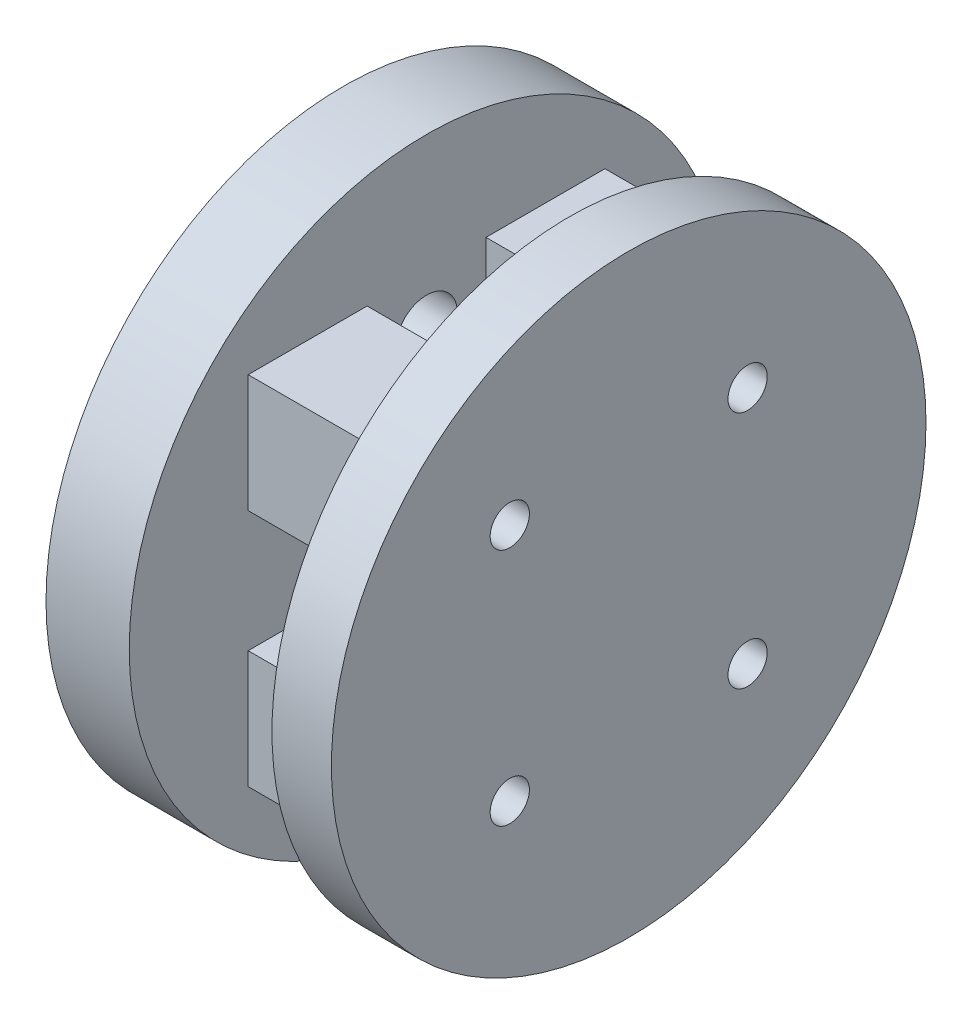
ISO-10303-21;
HEADER;
FILE_DESCRIPTION(('STEP AP214'),'2;1');
FILE_NAME('part.step','',(''),(''),'','','');
FILE_SCHEMA(('AUTOMOTIVE_DESIGN { 1 0 10303 214 1 1 1 1 }'));
ENDSEC;
DATA;
#1=APPLICATION_CONTEXT('core data for automotive mechanical design processes');
#2=APPLICATION_PROTOCOL_DEFINITION('international standard','automotive_design',2000,#1);
#3=PRODUCT_CONTEXT('',#1,'mechanical');
#4=PRODUCT('Part','Part','',(#3));
#5=PRODUCT_RELATED_PRODUCT_CATEGORY('part','',(#4));
#6=PRODUCT_DEFINITION_FORMATION('','',#4);
#7=PRODUCT_DEFINITION_CONTEXT('part definition',#1,'design');
#8=PRODUCT_DEFINITION('design','',#6,#7);
#9=PRODUCT_DEFINITION_SHAPE('','',#8);
#10=(LENGTH_UNIT() NAMED_UNIT(*) SI_UNIT(.MILLI.,.METRE.));
#11=(NAMED_UNIT(*) PLANE_ANGLE_UNIT() SI_UNIT($,.RADIAN.));
#12=(NAMED_UNIT(*) SI_UNIT($,.STERADIAN.) SOLID_ANGLE_UNIT());
#13=UNCERTAINTY_MEASURE_WITH_UNIT(LENGTH_MEASURE(1.E-05),#10,'distance_accuracy_value','');
#14=(GEOMETRIC_REPRESENTATION_CONTEXT(3) GLOBAL_UNCERTAINTY_ASSIGNED_CONTEXT((#13)) GLOBAL_UNIT_ASSIGNED_CONTEXT((#10,
#11,#12)) REPRESENTATION_CONTEXT('',''));
#15=CARTESIAN_POINT('',(0.,0.,0.));
#16=DIRECTION('',(0.,0.,1.));
#17=DIRECTION('',(1.,0.,0.));
#18=AXIS2_PLACEMENT_3D('',#15,#16,#17);
#19=CARTESIAN_POINT('',(24.,0.,0.));
#20=DIRECTION('',(-1.,0.,0.));
#21=DIRECTION('',(0.,0.,1.));
#22=AXIS2_PLACEMENT_3D('',#19,#20,#21);
#23=CYLINDRICAL_SURFACE('',#22,25.);
#24=CARTESIAN_POINT('',(24.,0.,0.));
#25=DIRECTION('',(1.,0.,0.));
#26=DIRECTION('',(0.,0.,-1.));
#27=AXIS2_PLACEMENT_3D('',#24,#25,#26);
#28=CIRCLE('',#27,25.);
#29=CARTESIAN_POINT('',(24.,0.,-25.));
#30=VERTEX_POINT('',#29);
#31=EDGE_CURVE('E11',#30,#30,#28,.T.);
#32=ORIENTED_EDGE('',*,*,#31,.F.);
#33=EDGE_LOOP('',(#32));
#34=FACE_BOUND('',#33,.T.);
#35=CARTESIAN_POINT('',(19.,0.,0.));
#36=DIRECTION('',(1.,0.,0.));
#37=DIRECTION('',(0.,0.,-1.));
#38=AXIS2_PLACEMENT_3D('',#35,#36,#37);
#39=CIRCLE('',#38,25.);
#40=CARTESIAN_POINT('',(19.,0.,-25.));
#41=VERTEX_POINT('',#40);
#42=EDGE_CURVE('E54',#41,#41,#39,.T.);
#43=ORIENTED_EDGE('',*,*,#42,.T.);
#44=EDGE_LOOP('',(#43));
#45=FACE_BOUND('',#44,.T.);
#46=ADVANCED_FACE('F47',(#34,#45),#23,.T.);
#47=CARTESIAN_POINT('',(24.,0.,0.));
#48=DIRECTION('',(1.,0.,0.));
#49=DIRECTION('',(0.,0.,-1.));
#50=AXIS2_PLACEMENT_3D('',#47,#48,#49);
#51=PLANE('',#50);
#52=CARTESIAN_POINT('',(24.,10.05,-10.));
#53=DIRECTION('',(1.,0.,0.));
#54=DIRECTION('',(0.,0.,-1.));
#55=AXIS2_PLACEMENT_3D('',#52,#53,#54);
#56=CIRCLE('',#55,1.65);
#57=CARTESIAN_POINT('',(24.,10.05,-11.65));
#58=VERTEX_POINT('',#57);
#59=EDGE_CURVE('E125',#58,#58,#56,.T.);
#60=ORIENTED_EDGE('',*,*,#59,.F.);
#61=EDGE_LOOP('',(#60));
#62=FACE_BOUND('',#61,.T.);
#63=CARTESIAN_POINT('',(24.,-10.05,-10.));
#64=DIRECTION('',(1.,0.,0.));
#65=DIRECTION('',(0.,0.,-1.));
#66=AXIS2_PLACEMENT_3D('',#63,#64,#65);
#67=CIRCLE('',#66,1.65);
#68=CARTESIAN_POINT('',(24.,-10.05,-11.65));
#69=VERTEX_POINT('',#68);
#70=EDGE_CURVE('E121',#69,#69,#67,.T.);
#71=ORIENTED_EDGE('',*,*,#70,.F.);
#72=EDGE_LOOP('',(#71));
#73=FACE_BOUND('',#72,.T.);
#74=CARTESIAN_POINT('',(24.,-10.05,10.));
#75=DIRECTION('',(1.,0.,0.));
#76=DIRECTION('',(0.,0.,-1.));
#77=AXIS2_PLACEMENT_3D('',#74,#75,#76);
#78=CIRCLE('',#77,1.65);
#79=CARTESIAN_POINT('',(24.,-10.05,8.35));
#80=VERTEX_POINT('',#79);
#81=EDGE_CURVE('E119',#80,#80,#78,.T.);
#82=ORIENTED_EDGE('',*,*,#81,.F.);
#83=EDGE_LOOP('',(#82));
#84=FACE_BOUND('',#83,.T.);
#85=CARTESIAN_POINT('',(24.,10.05,10.));
#86=DIRECTION('',(1.,0.,0.));
#87=DIRECTION('',(0.,0.,-1.));
#88=AXIS2_PLACEMENT_3D('',#85,#86,#87);
#89=CIRCLE('',#88,1.65);
#90=CARTESIAN_POINT('',(24.,10.05,8.35));
#91=VERTEX_POINT('',#90);
#92=EDGE_CURVE('E61',#91,#91,#89,.T.);
#93=ORIENTED_EDGE('',*,*,#92,.F.);
#94=EDGE_LOOP('',(#93));
#95=FACE_BOUND('',#94,.T.);
#96=ORIENTED_EDGE('',*,*,#31,.T.);
#97=EDGE_LOOP('',(#96));
#98=FACE_BOUND('',#97,.T.);
#99=ADVANCED_FACE('F92',(#62,#73,#84,#95,#98),#51,.T.);
#100=CARTESIAN_POINT('',(19.,0.,0.));
#101=DIRECTION('',(1.,0.,0.));
#102=DIRECTION('',(0.,0.,-1.));
#103=AXIS2_PLACEMENT_3D('',#100,#101,#102);
#104=PLANE('',#103);
#105=CARTESIAN_POINT('',(19.,10.05,-10.));
#106=DIRECTION('',(1.,0.,0.));
#107=DIRECTION('',(0.,0.,-1.));
#108=AXIS2_PLACEMENT_3D('',#105,#106,#107);
#109=CIRCLE('',#108,1.65);
#110=CARTESIAN_POINT('',(19.,10.05,-11.65));
#111=VERTEX_POINT('',#110);
#112=EDGE_CURVE('E50',#111,#111,#109,.T.);
#113=ORIENTED_EDGE('',*,*,#112,.T.);
#114=EDGE_LOOP('',(#113));
#115=FACE_BOUND('',#114,.T.);
#116=CARTESIAN_POINT('',(19.,-10.05,-10.));
#117=DIRECTION('',(1.,0.,0.));
#118=DIRECTION('',(0.,0.,-1.));
#119=AXIS2_PLACEMENT_3D('',#116,#117,#118);
#120=CIRCLE('',#119,1.65);
#121=CARTESIAN_POINT('',(19.,-10.05,-11.65));
#122=VERTEX_POINT('',#121);
#123=EDGE_CURVE('E69',#122,#122,#120,.T.);
#124=ORIENTED_EDGE('',*,*,#123,.T.);
#125=EDGE_LOOP('',(#124));
#126=FACE_BOUND('',#125,.T.);
#127=CARTESIAN_POINT('',(19.,-10.05,10.));
#128=DIRECTION('',(1.,0.,0.));
#129=DIRECTION('',(0.,0.,-1.));
#130=AXIS2_PLACEMENT_3D('',#127,#128,#129);
#131=CIRCLE('',#130,1.65);
#132=CARTESIAN_POINT('',(19.,-10.05,8.35));
#133=VERTEX_POINT('',#132);
#134=EDGE_CURVE('E67',#133,#133,#131,.T.);
#135=ORIENTED_EDGE('',*,*,#134,.T.);
#136=EDGE_LOOP('',(#135));
#137=FACE_BOUND('',#136,.T.);
#138=CARTESIAN_POINT('',(19.,10.05,10.));
#139=DIRECTION('',(1.,0.,0.));
#140=DIRECTION('',(0.,0.,-1.));
#141=AXIS2_PLACEMENT_3D('',#138,#139,#140);
#142=CIRCLE('',#141,1.65);
#143=CARTESIAN_POINT('',(19.,10.05,8.35));
#144=VERTEX_POINT('',#143);
#145=EDGE_CURVE('E64',#144,#144,#142,.T.);
#146=ORIENTED_EDGE('',*,*,#145,.T.);
#147=EDGE_LOOP('',(#146));
#148=FACE_BOUND('',#147,.T.);
#149=ORIENTED_EDGE('',*,*,#42,.F.);
#150=EDGE_LOOP('',(#149));
#151=FACE_BOUND('',#150,.T.);
#152=ADVANCED_FACE('F76',(#115,#126,#137,#148,#151),#104,.F.);
#153=CARTESIAN_POINT('',(0.,10.05,10.));
#154=DIRECTION('',(1.,0.,0.));
#155=DIRECTION('',(0.,0.,-1.));
#156=AXIS2_PLACEMENT_3D('',#153,#154,#155);
#157=CYLINDRICAL_SURFACE('',#156,1.65);
#158=ORIENTED_EDGE('',*,*,#92,.T.);
#159=EDGE_LOOP('',(#158));
#160=FACE_BOUND('',#159,.T.);
#161=ORIENTED_EDGE('',*,*,#145,.F.);
#162=EDGE_LOOP('',(#161));
#163=FACE_BOUND('',#162,.T.);
#164=ADVANCED_FACE('F103',(#160,#163),#157,.F.);
#165=CARTESIAN_POINT('',(0.,-10.05,10.));
#166=DIRECTION('',(1.,0.,0.));
#167=DIRECTION('',(0.,0.,-1.));
#168=AXIS2_PLACEMENT_3D('',#165,#166,#167);
#169=CYLINDRICAL_SURFACE('',#168,1.65);
#170=ORIENTED_EDGE('',*,*,#81,.T.);
#171=EDGE_LOOP('',(#170));
#172=FACE_BOUND('',#171,.T.);
#173=ORIENTED_EDGE('',*,*,#134,.F.);
#174=EDGE_LOOP('',(#173));
#175=FACE_BOUND('',#174,.T.);
#176=ADVANCED_FACE('F86',(#172,#175),#169,.F.);
#177=CARTESIAN_POINT('',(0.,-10.05,-10.));
#178=DIRECTION('',(1.,0.,0.));
#179=DIRECTION('',(0.,0.,-1.));
#180=AXIS2_PLACEMENT_3D('',#177,#178,#179);
#181=CYLINDRICAL_SURFACE('',#180,1.65);
#182=ORIENTED_EDGE('',*,*,#70,.T.);
#183=EDGE_LOOP('',(#182));
#184=FACE_BOUND('',#183,.T.);
#185=ORIENTED_EDGE('',*,*,#123,.F.);
#186=EDGE_LOOP('',(#185));
#187=FACE_BOUND('',#186,.T.);
#188=ADVANCED_FACE('F80',(#184,#187),#181,.F.);
#189=CARTESIAN_POINT('',(0.,10.05,-10.));
#190=DIRECTION('',(1.,0.,0.));
#191=DIRECTION('',(0.,0.,-1.));
#192=AXIS2_PLACEMENT_3D('',#189,#190,#191);
#193=CYLINDRICAL_SURFACE('',#192,1.65);
#194=ORIENTED_EDGE('',*,*,#59,.T.);
#195=EDGE_LOOP('',(#194));
#196=FACE_BOUND('',#195,.T.);
#197=ORIENTED_EDGE('',*,*,#112,.F.);
#198=EDGE_LOOP('',(#197));
#199=FACE_BOUND('',#198,.T.);
#200=ADVANCED_FACE('F78',(#196,#199),#193,.F.);
#201=CLOSED_SHELL('',(#46,#99,#152,#164,#176,#188,#200));
#202=MANIFOLD_SOLID_BREP('B2',#201);
#203=CARTESIAN_POINT('',(7.,15.,-15.));
#204=DIRECTION('',(0.,0.,1.));
#205=DIRECTION('',(0.,-1.,0.));
#206=AXIS2_PLACEMENT_3D('',#203,#204,#205);
#207=PLANE('',#206);
#208=DIRECTION('',(-1.,0.,0.));
#209=VECTOR('',#208,1.);
#210=CARTESIAN_POINT('',(7.,-15.,-15.));
#211=LINE('',#210,#209);
#212=CARTESIAN_POINT('',(19.,-15.,-15.));
#213=VERTEX_POINT('',#212);
#214=CARTESIAN_POINT('',(7.00000000000003,-15.,-15.));
#215=VERTEX_POINT('',#214);
#216=EDGE_CURVE('E287',#213,#215,#211,.T.);
#217=ORIENTED_EDGE('',*,*,#216,.T.);
#218=DIRECTION('',(0.,-1.,0.));
#219=VECTOR('',#218,1.);
#220=CARTESIAN_POINT('',(7.00000000000001,-15.,-15.));
#221=LINE('',#220,#219);
#222=CARTESIAN_POINT('',(7.00000000000001,-5.1,-15.));
#223=VERTEX_POINT('',#222);
#224=EDGE_CURVE('E337',#223,#215,#221,.T.);
#225=ORIENTED_EDGE('',*,*,#224,.F.);
#226=DIRECTION('',(-1.,0.,0.));
#227=VECTOR('',#226,1.);
#228=CARTESIAN_POINT('',(19.,-5.1,-15.));
#229=LINE('',#228,#227);
#230=CARTESIAN_POINT('',(19.,-5.1,-15.));
#231=VERTEX_POINT('',#230);
#232=EDGE_CURVE('E384',#231,#223,#229,.T.);
#233=ORIENTED_EDGE('',*,*,#232,.F.);
#234=DIRECTION('',(0.,1.,0.));
#235=VECTOR('',#234,1.);
#236=CARTESIAN_POINT('',(19.,-15.,-15.));
#237=LINE('',#236,#235);
#238=EDGE_CURVE('E403',#213,#231,#237,.T.);
#239=ORIENTED_EDGE('',*,*,#238,.F.);
#240=EDGE_LOOP('',(#217,#225,#233,#239));
#241=FACE_BOUND('',#240,.T.);
#242=ADVANCED_FACE('F172',(#241),#207,.F.);
#243=CARTESIAN_POINT('',(7.,15.,15.));
#244=DIRECTION('',(0.,-1.,0.));
#245=DIRECTION('',(0.,0.,-1.));
#246=AXIS2_PLACEMENT_3D('',#243,#244,#245);
#247=PLANE('',#246);
#248=DIRECTION('',(-1.,0.,0.));
#249=VECTOR('',#248,1.);
#250=CARTESIAN_POINT('',(7.,15.,-15.));
#251=LINE('',#250,#249);
#252=CARTESIAN_POINT('',(19.,15.,-15.));
#253=VERTEX_POINT('',#252);
#254=CARTESIAN_POINT('',(7.00000000000003,15.,-15.));
#255=VERTEX_POINT('',#254);
#256=EDGE_CURVE('E45',#253,#255,#251,.T.);
#257=ORIENTED_EDGE('',*,*,#256,.T.);
#258=DIRECTION('',(0.,0.,-1.));
#259=VECTOR('',#258,1.);
#260=CARTESIAN_POINT('',(7.00000000000001,15.,-15.));
#261=LINE('',#260,#259);
#262=CARTESIAN_POINT('',(7.00000000000001,15.,-5.));
#263=VERTEX_POINT('',#262);
#264=EDGE_CURVE('E330',#263,#255,#261,.T.);
#265=ORIENTED_EDGE('',*,*,#264,.F.);
#266=DIRECTION('',(-1.,0.,0.));
#267=VECTOR('',#266,1.);
#268=CARTESIAN_POINT('',(19.,15.,-5.));
#269=LINE('',#268,#267);
#270=CARTESIAN_POINT('',(19.,15.,-5.));
#271=VERTEX_POINT('',#270);
#272=EDGE_CURVE('E363',#271,#263,#269,.T.);
#273=ORIENTED_EDGE('',*,*,#272,.F.);
#274=DIRECTION('',(0.,0.,1.));
#275=VECTOR('',#274,1.);
#276=CARTESIAN_POINT('',(19.,15.,-15.));
#277=LINE('',#276,#275);
#278=EDGE_CURVE('E380',#253,#271,#277,.T.);
#279=ORIENTED_EDGE('',*,*,#278,.F.);
#280=EDGE_LOOP('',(#257,#265,#273,#279));
#281=FACE_BOUND('',#280,.T.);
#282=ADVANCED_FACE('F497',(#281),#247,.F.);
#283=CARTESIAN_POINT('',(7.,15.,15.));
#284=DIRECTION('',(0.,0.,-1.));
#285=DIRECTION('',(0.,1.,0.));
#286=AXIS2_PLACEMENT_3D('',#283,#284,#285);
#287=PLANE('',#286);
#288=DIRECTION('',(-1.,0.,0.));
#289=VECTOR('',#288,1.);
#290=CARTESIAN_POINT('',(7.,15.,15.));
#291=LINE('',#290,#289);
#292=CARTESIAN_POINT('',(19.,15.,15.));
#293=VERTEX_POINT('',#292);
#294=CARTESIAN_POINT('',(7.00000000000003,15.,15.));
#295=VERTEX_POINT('',#294);
#296=EDGE_CURVE('E181',#293,#295,#291,.T.);
#297=ORIENTED_EDGE('',*,*,#296,.T.);
#298=DIRECTION('',(0.,1.,0.));
#299=VECTOR('',#298,1.);
#300=CARTESIAN_POINT('',(7.00000000000001,15.,15.));
#301=LINE('',#300,#299);
#302=CARTESIAN_POINT('',(7.00000000000001,5.1,15.));
#303=VERTEX_POINT('',#302);
#304=EDGE_CURVE('E285',#303,#295,#301,.T.);
#305=ORIENTED_EDGE('',*,*,#304,.F.);
#306=DIRECTION('',(-1.,0.,0.));
#307=VECTOR('',#306,1.);
#308=CARTESIAN_POINT('',(19.,5.1,15.));
#309=LINE('',#308,#307);
#310=CARTESIAN_POINT('',(19.,5.1,15.));
#311=VERTEX_POINT('',#310);
#312=EDGE_CURVE('E282',#311,#303,#309,.T.);
#313=ORIENTED_EDGE('',*,*,#312,.F.);
#314=DIRECTION('',(0.,-1.,0.));
#315=VECTOR('',#314,1.);
#316=CARTESIAN_POINT('',(19.,15.,15.));
#317=LINE('',#316,#315);
#318=EDGE_CURVE('E269',#293,#311,#317,.T.);
#319=ORIENTED_EDGE('',*,*,#318,.F.);
#320=EDGE_LOOP('',(#297,#305,#313,#319));
#321=FACE_BOUND('',#320,.T.);
#322=ADVANCED_FACE('F283',(#321),#287,.F.);
#323=CARTESIAN_POINT('',(7.,-15.,15.));
#324=DIRECTION('',(0.,1.,0.));
#325=DIRECTION('',(0.,0.,1.));
#326=AXIS2_PLACEMENT_3D('',#323,#324,#325);
#327=PLANE('',#326);
#328=DIRECTION('',(-1.,0.,0.));
#329=VECTOR('',#328,1.);
#330=CARTESIAN_POINT('',(7.,-15.,15.));
#331=LINE('',#330,#329);
#332=CARTESIAN_POINT('',(19.,-15.,15.));
#333=VERTEX_POINT('',#332);
#334=CARTESIAN_POINT('',(7.00000000000001,-15.,15.));
#335=VERTEX_POINT('',#334);
#336=EDGE_CURVE('E306',#333,#335,#331,.T.);
#337=ORIENTED_EDGE('',*,*,#336,.T.);
#338=DIRECTION('',(0.,0.,1.));
#339=VECTOR('',#338,1.);
#340=CARTESIAN_POINT('',(7.00000000000001,-15.,15.));
#341=LINE('',#340,#339);
#342=CARTESIAN_POINT('',(7.00000000000001,-15.,5.));
#343=VERTEX_POINT('',#342);
#344=EDGE_CURVE('E336',#343,#335,#341,.T.);
#345=ORIENTED_EDGE('',*,*,#344,.F.);
#346=DIRECTION('',(-1.,0.,0.));
#347=VECTOR('',#346,1.);
#348=CARTESIAN_POINT('',(19.,-15.,5.));
#349=LINE('',#348,#347);
#350=CARTESIAN_POINT('',(19.,-15.,5.));
#351=VERTEX_POINT('',#350);
#352=EDGE_CURVE('E348',#351,#343,#349,.T.);
#353=ORIENTED_EDGE('',*,*,#352,.F.);
#354=DIRECTION('',(0.,0.,-1.));
#355=VECTOR('',#354,1.);
#356=CARTESIAN_POINT('',(19.,-15.,15.));
#357=LINE('',#356,#355);
#358=EDGE_CURVE('E425',#333,#351,#357,.T.);
#359=ORIENTED_EDGE('',*,*,#358,.F.);
#360=EDGE_LOOP('',(#337,#345,#353,#359));
#361=FACE_BOUND('',#360,.T.);
#362=ADVANCED_FACE('F442',(#361),#327,.F.);
#363=DIRECTION('',(-1.,0.,0.));
#364=VECTOR('',#363,1.);
#365=CARTESIAN_POINT('',(19.,5.1,-15.));
#366=LINE('',#365,#364);
#367=CARTESIAN_POINT('',(19.,5.1,-15.));
#368=VERTEX_POINT('',#367);
#369=CARTESIAN_POINT('',(7.00000000000001,5.1,-15.));
#370=VERTEX_POINT('',#369);
#371=EDGE_CURVE('E370',#368,#370,#366,.T.);
#372=ORIENTED_EDGE('',*,*,#371,.T.);
#373=EDGE_CURVE('E334',#255,#370,#221,.T.);
#374=ORIENTED_EDGE('',*,*,#373,.F.);
#375=ORIENTED_EDGE('',*,*,#256,.F.);
#376=DIRECTION('',(0.,1.,0.));
#377=VECTOR('',#376,1.);
#378=CARTESIAN_POINT('',(19.,5.1,-15.));
#379=LINE('',#378,#377);
#380=EDGE_CURVE('E375',#368,#253,#379,.T.);
#381=ORIENTED_EDGE('',*,*,#380,.F.);
#382=EDGE_LOOP('',(#372,#374,#375,#381));
#383=FACE_BOUND('',#382,.T.);
#384=ADVANCED_FACE('F174',(#383),#207,.F.);
#385=DIRECTION('',(-1.,0.,0.));
#386=VECTOR('',#385,1.);
#387=CARTESIAN_POINT('',(19.,15.,5.));
#388=LINE('',#387,#386);
#389=CARTESIAN_POINT('',(19.,15.,5.));
#390=VERTEX_POINT('',#389);
#391=CARTESIAN_POINT('',(7.00000000000001,15.,5.));
#392=VERTEX_POINT('',#391);
#393=EDGE_CURVE('E293',#390,#392,#388,.T.);
#394=ORIENTED_EDGE('',*,*,#393,.T.);
#395=EDGE_CURVE('E338',#295,#392,#261,.T.);
#396=ORIENTED_EDGE('',*,*,#395,.F.);
#397=ORIENTED_EDGE('',*,*,#296,.F.);
#398=DIRECTION('',(0.,0.,1.));
#399=VECTOR('',#398,1.);
#400=CARTESIAN_POINT('',(19.,15.,5.));
#401=LINE('',#400,#399);
#402=EDGE_CURVE('E276',#390,#293,#401,.T.);
#403=ORIENTED_EDGE('',*,*,#402,.F.);
#404=EDGE_LOOP('',(#394,#396,#397,#403));
#405=FACE_BOUND('',#404,.T.);
#406=ADVANCED_FACE('F524',(#405),#247,.F.);
#407=DIRECTION('',(-1.,0.,0.));
#408=VECTOR('',#407,1.);
#409=CARTESIAN_POINT('',(19.,-5.1,15.));
#410=LINE('',#409,#408);
#411=CARTESIAN_POINT('',(19.,-5.1,15.));
#412=VERTEX_POINT('',#411);
#413=CARTESIAN_POINT('',(7.00000000000001,-5.1,15.));
#414=VERTEX_POINT('',#413);
#415=EDGE_CURVE('E412',#412,#414,#410,.T.);
#416=ORIENTED_EDGE('',*,*,#415,.T.);
#417=EDGE_CURVE('E340',#335,#414,#301,.T.);
#418=ORIENTED_EDGE('',*,*,#417,.F.);
#419=ORIENTED_EDGE('',*,*,#336,.F.);
#420=DIRECTION('',(0.,-1.,0.));
#421=VECTOR('',#420,1.);
#422=CARTESIAN_POINT('',(19.,-5.1,15.));
#423=LINE('',#422,#421);
#424=EDGE_CURVE('E419',#412,#333,#423,.T.);
#425=ORIENTED_EDGE('',*,*,#424,.F.);
#426=EDGE_LOOP('',(#416,#418,#419,#425));
#427=FACE_BOUND('',#426,.T.);
#428=ADVANCED_FACE('F436',(#427),#287,.F.);
#429=DIRECTION('',(-1.,0.,0.));
#430=VECTOR('',#429,1.);
#431=CARTESIAN_POINT('',(19.,-15.,-5.));
#432=LINE('',#431,#430);
#433=CARTESIAN_POINT('',(19.,-15.,-5.));
#434=VERTEX_POINT('',#433);
#435=CARTESIAN_POINT('',(7.,-15.,-5.));
#436=VERTEX_POINT('',#435);
#437=EDGE_CURVE('E391',#434,#436,#432,.T.);
#438=ORIENTED_EDGE('',*,*,#437,.T.);
#439=EDGE_CURVE('E189',#215,#436,#341,.T.);
#440=ORIENTED_EDGE('',*,*,#439,.F.);
#441=ORIENTED_EDGE('',*,*,#216,.F.);
#442=DIRECTION('',(0.,0.,-1.));
#443=VECTOR('',#442,1.);
#444=CARTESIAN_POINT('',(19.,-15.,-5.));
#445=LINE('',#444,#443);
#446=EDGE_CURVE('E397',#434,#213,#445,.T.);
#447=ORIENTED_EDGE('',*,*,#446,.F.);
#448=EDGE_LOOP('',(#438,#440,#441,#447));
#449=FACE_BOUND('',#448,.T.);
#450=ADVANCED_FACE('F486',(#449),#327,.F.);
#451=CARTESIAN_POINT('',(7.,0.,0.));
#452=DIRECTION('',(1.,0.,0.));
#453=DIRECTION('',(0.,0.,-1.));
#454=AXIS2_PLACEMENT_3D('',#451,#452,#453);
#455=PLANE('',#454);
#456=ORIENTED_EDGE('',*,*,#373,.T.);
#457=DIRECTION('',(0.,0.,-1.));
#458=VECTOR('',#457,1.);
#459=CARTESIAN_POINT('',(7.,5.1,-5.));
#460=LINE('',#459,#458);
#461=CARTESIAN_POINT('',(7.,5.1,-5.));
#462=VERTEX_POINT('',#461);
#463=EDGE_CURVE('E222',#462,#370,#460,.T.);
#464=ORIENTED_EDGE('',*,*,#463,.F.);
#465=DIRECTION('',(0.,-1.,0.));
#466=VECTOR('',#465,1.);
#467=CARTESIAN_POINT('',(7.,15.,-5.));
#468=LINE('',#467,#466);
#469=EDGE_CURVE('E299',#263,#462,#468,.T.);
#470=ORIENTED_EDGE('',*,*,#469,.F.);
#471=ORIENTED_EDGE('',*,*,#264,.T.);
#472=EDGE_LOOP('',(#456,#464,#470,#471));
#473=FACE_BOUND('',#472,.T.);
#474=ORIENTED_EDGE('',*,*,#395,.T.);
#475=DIRECTION('',(0.,1.,0.));
#476=VECTOR('',#475,1.);
#477=CARTESIAN_POINT('',(7.,5.1,5.));
#478=LINE('',#477,#476);
#479=CARTESIAN_POINT('',(7.,5.1,5.));
#480=VERTEX_POINT('',#479);
#481=EDGE_CURVE('E211',#480,#392,#478,.T.);
#482=ORIENTED_EDGE('',*,*,#481,.F.);
#483=DIRECTION('',(0.,0.,-1.));
#484=VECTOR('',#483,1.);
#485=CARTESIAN_POINT('',(7.,5.1,15.));
#486=LINE('',#485,#484);
#487=EDGE_CURVE('E297',#303,#480,#486,.T.);
#488=ORIENTED_EDGE('',*,*,#487,.F.);
#489=ORIENTED_EDGE('',*,*,#304,.T.);
#490=EDGE_LOOP('',(#474,#482,#488,#489));
#491=FACE_BOUND('',#490,.T.);
#492=ORIENTED_EDGE('',*,*,#417,.T.);
#493=DIRECTION('',(0.,0.,1.));
#494=VECTOR('',#493,1.);
#495=CARTESIAN_POINT('',(7.,-5.1,5.));
#496=LINE('',#495,#494);
#497=CARTESIAN_POINT('',(7.,-5.1,5.));
#498=VERTEX_POINT('',#497);
#499=EDGE_CURVE('E416',#498,#414,#496,.T.);
#500=ORIENTED_EDGE('',*,*,#499,.F.);
#501=DIRECTION('',(0.,1.,0.));
#502=VECTOR('',#501,1.);
#503=CARTESIAN_POINT('',(7.,-15.,5.));
#504=LINE('',#503,#502);
#505=EDGE_CURVE('E388',#343,#498,#504,.T.);
#506=ORIENTED_EDGE('',*,*,#505,.F.);
#507=ORIENTED_EDGE('',*,*,#344,.T.);
#508=EDGE_LOOP('',(#492,#500,#506,#507));
#509=FACE_BOUND('',#508,.T.);
#510=CARTESIAN_POINT('',(7.,10.7,0.));
#511=DIRECTION('',(1.,0.,0.));
#512=DIRECTION('',(0.,0.,-1.));
#513=AXIS2_PLACEMENT_3D('',#510,#511,#512);
#514=CIRCLE('',#513,2.59630787526163);
#515=CARTESIAN_POINT('',(7.,10.7,-2.59630787526163));
#516=VERTEX_POINT('',#515);
#517=EDGE_CURVE('E349',#516,#516,#514,.T.);
#518=ORIENTED_EDGE('',*,*,#517,.F.);
#519=EDGE_LOOP('',(#518));
#520=FACE_BOUND('',#519,.T.);
#521=CARTESIAN_POINT('',(7.,-10.7,0.));
#522=DIRECTION('',(1.,0.,0.));
#523=DIRECTION('',(0.,0.,-1.));
#524=AXIS2_PLACEMENT_3D('',#521,#522,#523);
#525=CIRCLE('',#524,2.59630787526163);
#526=CARTESIAN_POINT('',(7.,-10.7,-2.59630787526164));
#527=VERTEX_POINT('',#526);
#528=EDGE_CURVE('E352',#527,#527,#525,.T.);
#529=ORIENTED_EDGE('',*,*,#528,.F.);
#530=EDGE_LOOP('',(#529));
#531=FACE_BOUND('',#530,.T.);
#532=CARTESIAN_POINT('',(7.,0.,0.));
#533=DIRECTION('',(1.,0.,0.));
#534=DIRECTION('',(0.,0.,-1.));
#535=AXIS2_PLACEMENT_3D('',#532,#533,#534);
#536=CIRCLE('',#535,2.59630787526163);
#537=CARTESIAN_POINT('',(7.,0.,-2.59630787526163));
#538=VERTEX_POINT('',#537);
#539=EDGE_CURVE('E358',#538,#538,#536,.T.);
#540=ORIENTED_EDGE('',*,*,#539,.F.);
#541=EDGE_LOOP('',(#540));
#542=FACE_BOUND('',#541,.T.);
#543=DIRECTION('',(0.,0.,1.));
#544=VECTOR('',#543,1.);
#545=CARTESIAN_POINT('',(7.,-5.1,-15.));
#546=LINE('',#545,#544);
#547=CARTESIAN_POINT('',(7.,-5.1,-5.));
#548=VERTEX_POINT('',#547);
#549=EDGE_CURVE('E367',#223,#548,#546,.T.);
#550=ORIENTED_EDGE('',*,*,#549,.F.);
#551=ORIENTED_EDGE('',*,*,#224,.T.);
#552=ORIENTED_EDGE('',*,*,#439,.T.);
#553=DIRECTION('',(0.,-1.,0.));
#554=VECTOR('',#553,1.);
#555=CARTESIAN_POINT('',(7.,-5.1,-5.));
#556=LINE('',#555,#554);
#557=EDGE_CURVE('E395',#548,#436,#556,.T.);
#558=ORIENTED_EDGE('',*,*,#557,.F.);
#559=EDGE_LOOP('',(#550,#551,#552,#558));
#560=FACE_BOUND('',#559,.T.);
#561=CARTESIAN_POINT('',(7.00000000000001,0.,0.));
#562=DIRECTION('',(1.,0.,0.));
#563=DIRECTION('',(0.,0.,-1.));
#564=AXIS2_PLACEMENT_3D('',#561,#562,#563);
#565=CIRCLE('',#564,25.);
#566=CARTESIAN_POINT('',(6.99999999999999,0.,25.));
#567=VERTEX_POINT('',#566);
#568=EDGE_CURVE('E321',#567,#567,#565,.F.);
#569=ORIENTED_EDGE('',*,*,#568,.F.);
#570=EDGE_LOOP('',(#569));
#571=FACE_BOUND('',#570,.T.);
#572=ADVANCED_FACE('F453',(#473,#491,#509,#520,#531,#542,#560,#571),#455,.T.);
#573=CARTESIAN_POINT('',(0.,0.,0.));
#574=DIRECTION('',(1.,0.,0.));
#575=DIRECTION('',(0.,0.,-1.));
#576=AXIS2_PLACEMENT_3D('',#573,#574,#575);
#577=PLANE('',#576);
#578=CARTESIAN_POINT('',(0.,10.7,0.));
#579=DIRECTION('',(1.,0.,0.));
#580=DIRECTION('',(0.,0.,-1.));
#581=AXIS2_PLACEMENT_3D('',#578,#579,#580);
#582=CIRCLE('',#581,2.59630787526163);
#583=CARTESIAN_POINT('',(0.,10.7,-2.59630787526163));
#584=VERTEX_POINT('',#583);
#585=EDGE_CURVE('E345',#584,#584,#582,.T.);
#586=ORIENTED_EDGE('',*,*,#585,.T.);
#587=EDGE_LOOP('',(#586));
#588=FACE_BOUND('',#587,.T.);
#589=CARTESIAN_POINT('',(0.,-10.7,0.));
#590=DIRECTION('',(1.,0.,0.));
#591=DIRECTION('',(0.,0.,-1.));
#592=AXIS2_PLACEMENT_3D('',#589,#590,#591);
#593=CIRCLE('',#592,2.59630787526163);
#594=CARTESIAN_POINT('',(0.,-10.7,-2.59630787526164));
#595=VERTEX_POINT('',#594);
#596=EDGE_CURVE('E355',#595,#595,#593,.T.);
#597=ORIENTED_EDGE('',*,*,#596,.T.);
#598=EDGE_LOOP('',(#597));
#599=FACE_BOUND('',#598,.T.);
#600=CARTESIAN_POINT('',(0.,0.,0.));
#601=DIRECTION('',(1.,0.,0.));
#602=DIRECTION('',(0.,0.,-1.));
#603=AXIS2_PLACEMENT_3D('',#600,#601,#602);
#604=CIRCLE('',#603,2.59630787526163);
#605=CARTESIAN_POINT('',(0.,0.,-2.59630787526163));
#606=VERTEX_POINT('',#605);
#607=EDGE_CURVE('E343',#606,#606,#604,.T.);
#608=ORIENTED_EDGE('',*,*,#607,.T.);
#609=EDGE_LOOP('',(#608));
#610=FACE_BOUND('',#609,.T.);
#611=CARTESIAN_POINT('',(0.,0.,0.));
#612=DIRECTION('',(-1.,0.,0.));
#613=DIRECTION('',(0.,0.,1.));
#614=AXIS2_PLACEMENT_3D('',#611,#612,#613);
#615=CIRCLE('',#614,25.);
#616=CARTESIAN_POINT('',(0.,0.,25.));
#617=VERTEX_POINT('',#616);
#618=EDGE_CURVE('E325',#617,#617,#615,.T.);
#619=ORIENTED_EDGE('',*,*,#618,.T.);
#620=EDGE_LOOP('',(#619));
#621=FACE_BOUND('',#620,.T.);
#622=ADVANCED_FACE('F542',(#588,#599,#610,#621),#577,.F.);
#623=CARTESIAN_POINT('',(19.,5.1,15.));
#624=DIRECTION('',(0.,1.,0.));
#625=DIRECTION('',(0.,0.,1.));
#626=AXIS2_PLACEMENT_3D('',#623,#624,#625);
#627=PLANE('',#626);
#628=ORIENTED_EDGE('',*,*,#487,.T.);
#629=DIRECTION('',(-1.,0.,0.));
#630=VECTOR('',#629,1.);
#631=CARTESIAN_POINT('',(19.,5.1,5.));
#632=LINE('',#631,#630);
#633=CARTESIAN_POINT('',(19.,5.1,5.));
#634=VERTEX_POINT('',#633);
#635=EDGE_CURVE('E288',#634,#480,#632,.T.);
#636=ORIENTED_EDGE('',*,*,#635,.F.);
#637=DIRECTION('',(0.,0.,-1.));
#638=VECTOR('',#637,1.);
#639=CARTESIAN_POINT('',(19.,5.1,15.));
#640=LINE('',#639,#638);
#641=EDGE_CURVE('E273',#311,#634,#640,.T.);
#642=ORIENTED_EDGE('',*,*,#641,.F.);
#643=ORIENTED_EDGE('',*,*,#312,.T.);
#644=EDGE_LOOP('',(#628,#636,#642,#643));
#645=FACE_BOUND('',#644,.T.);
#646=ADVANCED_FACE('F290',(#645),#627,.F.);
#647=CARTESIAN_POINT('',(19.,5.1,5.));
#648=DIRECTION('',(0.,0.,1.));
#649=DIRECTION('',(1.,0.,0.));
#650=AXIS2_PLACEMENT_3D('',#647,#648,#649);
#651=PLANE('',#650);
#652=ORIENTED_EDGE('',*,*,#481,.T.);
#653=ORIENTED_EDGE('',*,*,#393,.F.);
#654=DIRECTION('',(0.,1.,0.));
#655=VECTOR('',#654,1.);
#656=CARTESIAN_POINT('',(19.,5.1,5.));
#657=LINE('',#656,#655);
#658=EDGE_CURVE('E198',#634,#390,#657,.T.);
#659=ORIENTED_EDGE('',*,*,#658,.F.);
#660=ORIENTED_EDGE('',*,*,#635,.T.);
#661=EDGE_LOOP('',(#652,#653,#659,#660));
#662=FACE_BOUND('',#661,.T.);
#663=ADVANCED_FACE('F515',(#662),#651,.F.);
#664=CARTESIAN_POINT('',(19.,0.,0.));
#665=DIRECTION('',(1.,0.,0.));
#666=DIRECTION('',(0.,0.,-1.));
#667=AXIS2_PLACEMENT_3D('',#664,#665,#666);
#668=PLANE('',#667);
#669=CARTESIAN_POINT('',(19.,10.05,10.));
#670=DIRECTION('',(1.,0.,0.));
#671=DIRECTION('',(0.,0.,-1.));
#672=AXIS2_PLACEMENT_3D('',#669,#670,#671);
#673=CIRCLE('',#672,1.45);
#674=CARTESIAN_POINT('',(19.,10.05,8.55));
#675=VERTEX_POINT('',#674);
#676=EDGE_CURVE('E176',#675,#675,#673,.T.);
#677=ORIENTED_EDGE('',*,*,#676,.F.);
#678=EDGE_LOOP('',(#677));
#679=FACE_BOUND('',#678,.T.);
#680=ORIENTED_EDGE('',*,*,#402,.T.);
#681=ORIENTED_EDGE('',*,*,#318,.T.);
#682=ORIENTED_EDGE('',*,*,#641,.T.);
#683=ORIENTED_EDGE('',*,*,#658,.T.);
#684=EDGE_LOOP('',(#680,#681,#682,#683));
#685=FACE_BOUND('',#684,.T.);
#686=ADVANCED_FACE('F271',(#679,#685),#668,.T.);
#687=CARTESIAN_POINT('',(19.,15.,-5.));
#688=DIRECTION('',(0.,0.,-1.));
#689=DIRECTION('',(0.,1.,0.));
#690=AXIS2_PLACEMENT_3D('',#687,#688,#689);
#691=PLANE('',#690);
#692=ORIENTED_EDGE('',*,*,#469,.T.);
#693=DIRECTION('',(-1.,0.,0.));
#694=VECTOR('',#693,1.);
#695=CARTESIAN_POINT('',(19.,5.1,-5.));
#696=LINE('',#695,#694);
#697=CARTESIAN_POINT('',(19.,5.1,-5.));
#698=VERTEX_POINT('',#697);
#699=EDGE_CURVE('E366',#698,#462,#696,.T.);
#700=ORIENTED_EDGE('',*,*,#699,.F.);
#701=DIRECTION('',(0.,-1.,0.));
#702=VECTOR('',#701,1.);
#703=CARTESIAN_POINT('',(19.,15.,-5.));
#704=LINE('',#703,#702);
#705=EDGE_CURVE('E378',#271,#698,#704,.T.);
#706=ORIENTED_EDGE('',*,*,#705,.F.);
#707=ORIENTED_EDGE('',*,*,#272,.T.);
#708=EDGE_LOOP('',(#692,#700,#706,#707));
#709=FACE_BOUND('',#708,.T.);
#710=ADVANCED_FACE('F506',(#709),#691,.F.);
#711=CARTESIAN_POINT('',(19.,5.1,-5.));
#712=DIRECTION('',(0.,1.,0.));
#713=DIRECTION('',(0.,0.,1.));
#714=AXIS2_PLACEMENT_3D('',#711,#712,#713);
#715=PLANE('',#714);
#716=ORIENTED_EDGE('',*,*,#463,.T.);
#717=ORIENTED_EDGE('',*,*,#371,.F.);
#718=DIRECTION('',(0.,0.,-1.));
#719=VECTOR('',#718,1.);
#720=CARTESIAN_POINT('',(19.,5.1,-5.));
#721=LINE('',#720,#719);
#722=EDGE_CURVE('E373',#698,#368,#721,.T.);
#723=ORIENTED_EDGE('',*,*,#722,.F.);
#724=ORIENTED_EDGE('',*,*,#699,.T.);
#725=EDGE_LOOP('',(#716,#717,#723,#724));
#726=FACE_BOUND('',#725,.T.);
#727=ADVANCED_FACE('F504',(#726),#715,.F.);
#728=CARTESIAN_POINT('',(19.,0.,0.));
#729=DIRECTION('',(1.,0.,0.));
#730=DIRECTION('',(0.,0.,-1.));
#731=AXIS2_PLACEMENT_3D('',#728,#729,#730);
#732=PLANE('',#731);
#733=CARTESIAN_POINT('',(19.,10.05,-10.));
#734=DIRECTION('',(1.,0.,0.));
#735=DIRECTION('',(0.,0.,-1.));
#736=AXIS2_PLACEMENT_3D('',#733,#734,#735);
#737=CIRCLE('',#736,1.45);
#738=CARTESIAN_POINT('',(19.,10.05,-11.45));
#739=VERTEX_POINT('',#738);
#740=EDGE_CURVE('E316',#739,#739,#737,.T.);
#741=ORIENTED_EDGE('',*,*,#740,.F.);
#742=EDGE_LOOP('',(#741));
#743=FACE_BOUND('',#742,.T.);
#744=ORIENTED_EDGE('',*,*,#380,.T.);
#745=ORIENTED_EDGE('',*,*,#278,.T.);
#746=ORIENTED_EDGE('',*,*,#705,.T.);
#747=ORIENTED_EDGE('',*,*,#722,.T.);
#748=EDGE_LOOP('',(#744,#745,#746,#747));
#749=FACE_BOUND('',#748,.T.);
#750=ADVANCED_FACE('F500',(#743,#749),#732,.T.);
#751=CARTESIAN_POINT('',(19.,-5.1,-15.));
#752=DIRECTION('',(0.,-1.,0.));
#753=DIRECTION('',(0.,0.,-1.));
#754=AXIS2_PLACEMENT_3D('',#751,#752,#753);
#755=PLANE('',#754);
#756=ORIENTED_EDGE('',*,*,#549,.T.);
#757=DIRECTION('',(-1.,0.,0.));
#758=VECTOR('',#757,1.);
#759=CARTESIAN_POINT('',(19.,-5.1,-5.));
#760=LINE('',#759,#758);
#761=CARTESIAN_POINT('',(19.,-5.1,-5.));
#762=VERTEX_POINT('',#761);
#763=EDGE_CURVE('E387',#762,#548,#760,.T.);
#764=ORIENTED_EDGE('',*,*,#763,.F.);
#765=DIRECTION('',(0.,0.,1.));
#766=VECTOR('',#765,1.);
#767=CARTESIAN_POINT('',(19.,-5.1,-15.));
#768=LINE('',#767,#766);
#769=EDGE_CURVE('E401',#231,#762,#768,.T.);
#770=ORIENTED_EDGE('',*,*,#769,.F.);
#771=ORIENTED_EDGE('',*,*,#232,.T.);
#772=EDGE_LOOP('',(#756,#764,#770,#771));
#773=FACE_BOUND('',#772,.T.);
#774=ADVANCED_FACE('F479',(#773),#755,.F.);
#775=CARTESIAN_POINT('',(19.,-5.1,-5.));
#776=DIRECTION('',(0.,0.,-1.));
#777=DIRECTION('',(0.,1.,0.));
#778=AXIS2_PLACEMENT_3D('',#775,#776,#777);
#779=PLANE('',#778);
#780=ORIENTED_EDGE('',*,*,#557,.T.);
#781=ORIENTED_EDGE('',*,*,#437,.F.);
#782=DIRECTION('',(0.,-1.,0.));
#783=VECTOR('',#782,1.);
#784=CARTESIAN_POINT('',(19.,-5.1,-5.));
#785=LINE('',#784,#783);
#786=EDGE_CURVE('E394',#762,#434,#785,.T.);
#787=ORIENTED_EDGE('',*,*,#786,.F.);
#788=ORIENTED_EDGE('',*,*,#763,.T.);
#789=EDGE_LOOP('',(#780,#781,#787,#788));
#790=FACE_BOUND('',#789,.T.);
#791=ADVANCED_FACE('F770',(#790),#779,.F.);
#792=CARTESIAN_POINT('',(19.,0.,0.));
#793=DIRECTION('',(1.,0.,0.));
#794=DIRECTION('',(0.,0.,-1.));
#795=AXIS2_PLACEMENT_3D('',#792,#793,#794);
#796=PLANE('',#795);
#797=CARTESIAN_POINT('',(19.,-10.05,-10.));
#798=DIRECTION('',(1.,0.,0.));
#799=DIRECTION('',(0.,0.,-1.));
#800=AXIS2_PLACEMENT_3D('',#797,#798,#799);
#801=CIRCLE('',#800,1.45);
#802=CARTESIAN_POINT('',(19.,-10.05,-11.45));
#803=VERTEX_POINT('',#802);
#804=EDGE_CURVE('E313',#803,#803,#801,.T.);
#805=ORIENTED_EDGE('',*,*,#804,.F.);
#806=EDGE_LOOP('',(#805));
#807=FACE_BOUND('',#806,.T.);
#808=ORIENTED_EDGE('',*,*,#446,.T.);
#809=ORIENTED_EDGE('',*,*,#238,.T.);
#810=ORIENTED_EDGE('',*,*,#769,.T.);
#811=ORIENTED_EDGE('',*,*,#786,.T.);
#812=EDGE_LOOP('',(#808,#809,#810,#811));
#813=FACE_BOUND('',#812,.T.);
#814=ADVANCED_FACE('F482',(#807,#813),#796,.T.);
#815=CARTESIAN_POINT('',(19.,-15.,5.));
#816=DIRECTION('',(0.,0.,1.));
#817=DIRECTION('',(1.,0.,0.));
#818=AXIS2_PLACEMENT_3D('',#815,#816,#817);
#819=PLANE('',#818);
#820=ORIENTED_EDGE('',*,*,#505,.T.);
#821=DIRECTION('',(-1.,0.,0.));
#822=VECTOR('',#821,1.);
#823=CARTESIAN_POINT('',(19.,-5.1,5.));
#824=LINE('',#823,#822);
#825=CARTESIAN_POINT('',(19.,-5.1,5.));
#826=VERTEX_POINT('',#825);
#827=EDGE_CURVE('E409',#826,#498,#824,.T.);
#828=ORIENTED_EDGE('',*,*,#827,.F.);
#829=DIRECTION('',(0.,1.,0.));
#830=VECTOR('',#829,1.);
#831=CARTESIAN_POINT('',(19.,-15.,5.));
#832=LINE('',#831,#830);
#833=EDGE_CURVE('E423',#351,#826,#832,.T.);
#834=ORIENTED_EDGE('',*,*,#833,.F.);
#835=ORIENTED_EDGE('',*,*,#352,.T.);
#836=EDGE_LOOP('',(#820,#828,#834,#835));
#837=FACE_BOUND('',#836,.T.);
#838=ADVANCED_FACE('F449',(#837),#819,.F.);
#839=CARTESIAN_POINT('',(19.,-5.1,5.));
#840=DIRECTION('',(0.,-1.,0.));
#841=DIRECTION('',(0.,0.,-1.));
#842=AXIS2_PLACEMENT_3D('',#839,#840,#841);
#843=PLANE('',#842);
#844=ORIENTED_EDGE('',*,*,#499,.T.);
#845=ORIENTED_EDGE('',*,*,#415,.F.);
#846=DIRECTION('',(0.,0.,1.));
#847=VECTOR('',#846,1.);
#848=CARTESIAN_POINT('',(19.,-5.1,5.));
#849=LINE('',#848,#847);
#850=EDGE_CURVE('E415',#826,#412,#849,.T.);
#851=ORIENTED_EDGE('',*,*,#850,.F.);
#852=ORIENTED_EDGE('',*,*,#827,.T.);
#853=EDGE_LOOP('',(#844,#845,#851,#852));
#854=FACE_BOUND('',#853,.T.);
#855=ADVANCED_FACE('F451',(#854),#843,.F.);
#856=CARTESIAN_POINT('',(19.,0.,0.));
#857=DIRECTION('',(1.,0.,0.));
#858=DIRECTION('',(0.,0.,-1.));
#859=AXIS2_PLACEMENT_3D('',#856,#857,#858);
#860=PLANE('',#859);
#861=CARTESIAN_POINT('',(19.,-10.05,10.));
#862=DIRECTION('',(1.,0.,0.));
#863=DIRECTION('',(0.,0.,-1.));
#864=AXIS2_PLACEMENT_3D('',#861,#862,#863);
#865=CIRCLE('',#864,1.45);
#866=CARTESIAN_POINT('',(19.,-10.05,8.55));
#867=VERTEX_POINT('',#866);
#868=EDGE_CURVE('E310',#867,#867,#865,.T.);
#869=ORIENTED_EDGE('',*,*,#868,.F.);
#870=EDGE_LOOP('',(#869));
#871=FACE_BOUND('',#870,.T.);
#872=ORIENTED_EDGE('',*,*,#424,.T.);
#873=ORIENTED_EDGE('',*,*,#358,.T.);
#874=ORIENTED_EDGE('',*,*,#833,.T.);
#875=ORIENTED_EDGE('',*,*,#850,.T.);
#876=EDGE_LOOP('',(#872,#873,#874,#875));
#877=FACE_BOUND('',#876,.T.);
#878=ADVANCED_FACE('F430',(#871,#877),#860,.T.);
#879=CARTESIAN_POINT('',(0.,0.,0.));
#880=DIRECTION('',(1.,0.,0.));
#881=DIRECTION('',(0.,0.,-1.));
#882=AXIS2_PLACEMENT_3D('',#879,#880,#881);
#883=CYLINDRICAL_SURFACE('',#882,2.59630787526163);
#884=ORIENTED_EDGE('',*,*,#607,.F.);
#885=EDGE_LOOP('',(#884));
#886=FACE_BOUND('',#885,.T.);
#887=ORIENTED_EDGE('',*,*,#539,.T.);
#888=EDGE_LOOP('',(#887));
#889=FACE_BOUND('',#888,.T.);
#890=ADVANCED_FACE('F705',(#886,#889),#883,.F.);
#891=CARTESIAN_POINT('',(0.,-10.7,0.));
#892=DIRECTION('',(1.,0.,0.));
#893=DIRECTION('',(0.,0.,-1.));
#894=AXIS2_PLACEMENT_3D('',#891,#892,#893);
#895=CYLINDRICAL_SURFACE('',#894,2.59630787526163);
#896=ORIENTED_EDGE('',*,*,#596,.F.);
#897=EDGE_LOOP('',(#896));
#898=FACE_BOUND('',#897,.T.);
#899=ORIENTED_EDGE('',*,*,#528,.T.);
#900=EDGE_LOOP('',(#899));
#901=FACE_BOUND('',#900,.T.);
#902=ADVANCED_FACE('F702',(#898,#901),#895,.F.);
#903=CARTESIAN_POINT('',(0.,10.7,0.));
#904=DIRECTION('',(1.,0.,0.));
#905=DIRECTION('',(0.,0.,-1.));
#906=AXIS2_PLACEMENT_3D('',#903,#904,#905);
#907=CYLINDRICAL_SURFACE('',#906,2.59630787526163);
#908=ORIENTED_EDGE('',*,*,#585,.F.);
#909=EDGE_LOOP('',(#908));
#910=FACE_BOUND('',#909,.T.);
#911=ORIENTED_EDGE('',*,*,#517,.T.);
#912=EDGE_LOOP('',(#911));
#913=FACE_BOUND('',#912,.T.);
#914=ADVANCED_FACE('F616',(#910,#913),#907,.F.);
#915=CARTESIAN_POINT('',(77.7106781186548,0.,0.));
#916=DIRECTION('',(-1.,0.,0.));
#917=DIRECTION('',(0.,0.,1.));
#918=AXIS2_PLACEMENT_3D('',#915,#916,#917);
#919=CYLINDRICAL_SURFACE('',#918,25.);
#920=CARTESIAN_POINT('',(0.,0.,25.));
#921=CARTESIAN_POINT('',(0.0729166666666817,0.,25.));
#922=CARTESIAN_POINT('',(0.14583333333335,0.,25.));
#923=CARTESIAN_POINT('',(0.291666666666681,0.,25.));
#924=CARTESIAN_POINT('',(0.364583333333344,0.,25.));
#925=CARTESIAN_POINT('',(0.510416666666675,0.,25.));
#926=CARTESIAN_POINT('',(0.583333333333343,0.,25.));
#927=CARTESIAN_POINT('',(0.729166666666679,0.,25.));
#928=CARTESIAN_POINT('',(0.802083333333347,0.,25.));
#929=CARTESIAN_POINT('',(0.947916666666678,0.,25.));
#930=CARTESIAN_POINT('',(1.02083333333334,0.,25.));
#931=CARTESIAN_POINT('',(1.16666666666667,0.,25.));
#932=CARTESIAN_POINT('',(1.23958333333334,0.,25.));
#933=CARTESIAN_POINT('',(1.38541666666668,0.,25.));
#934=CARTESIAN_POINT('',(1.45833333333334,0.,25.));
#935=CARTESIAN_POINT('',(1.60416666666668,0.,25.));
#936=CARTESIAN_POINT('',(1.67708333333335,0.,25.));
#937=CARTESIAN_POINT('',(1.82291666666668,0.,25.));
#938=CARTESIAN_POINT('',(1.89583333333334,0.,25.));
#939=CARTESIAN_POINT('',(2.04166666666667,0.,25.));
#940=CARTESIAN_POINT('',(2.11458333333334,0.,25.));
#941=CARTESIAN_POINT('',(2.26041666666668,0.,25.));
#942=CARTESIAN_POINT('',(2.33333333333334,0.,25.));
#943=CARTESIAN_POINT('',(2.47916666666668,0.,25.));
#944=CARTESIAN_POINT('',(2.55208333333334,0.,25.));
#945=CARTESIAN_POINT('',(2.69791666666667,0.,25.));
#946=CARTESIAN_POINT('',(2.77083333333334,0.,25.));
#947=CARTESIAN_POINT('',(2.91666666666667,0.,25.));
#948=CARTESIAN_POINT('',(2.98958333333334,0.,25.));
#949=CARTESIAN_POINT('',(3.13541666666667,0.,25.));
#950=CARTESIAN_POINT('',(3.20833333333334,0.,25.));
#951=CARTESIAN_POINT('',(3.35416666666667,0.,25.));
#952=CARTESIAN_POINT('',(3.42708333333334,0.,25.));
#953=CARTESIAN_POINT('',(3.57291666666667,0.,25.));
#954=CARTESIAN_POINT('',(3.64583333333334,0.,25.));
#955=CARTESIAN_POINT('',(3.79166666666667,0.,25.));
#956=CARTESIAN_POINT('',(3.86458333333333,0.,25.));
#957=CARTESIAN_POINT('',(4.01041666666666,0.,25.));
#958=CARTESIAN_POINT('',(4.08333333333333,0.,25.));
#959=CARTESIAN_POINT('',(4.22916666666667,0.,25.));
#960=CARTESIAN_POINT('',(4.30208333333334,0.,25.));
#961=CARTESIAN_POINT('',(4.44791666666667,0.,25.));
#962=CARTESIAN_POINT('',(4.52083333333333,0.,25.));
#963=CARTESIAN_POINT('',(4.66666666666666,0.,25.));
#964=CARTESIAN_POINT('',(4.73958333333333,0.,25.));
#965=CARTESIAN_POINT('',(4.88541666666667,0.,25.));
#966=CARTESIAN_POINT('',(4.95833333333333,0.,25.));
#967=CARTESIAN_POINT('',(5.10416666666666,0.,25.));
#968=CARTESIAN_POINT('',(5.17708333333333,0.,25.));
#969=CARTESIAN_POINT('',(5.32291666666666,0.,25.));
#970=CARTESIAN_POINT('',(5.39583333333333,0.,25.));
#971=CARTESIAN_POINT('',(5.54166666666666,0.,25.));
#972=CARTESIAN_POINT('',(5.61458333333333,0.,25.));
#973=CARTESIAN_POINT('',(5.76041666666667,0.,25.));
#974=CARTESIAN_POINT('',(5.83333333333333,0.,25.));
#975=CARTESIAN_POINT('',(5.97916666666667,0.,25.));
#976=CARTESIAN_POINT('',(6.05208333333333,0.,25.));
#977=CARTESIAN_POINT('',(6.19791666666666,0.,25.));
#978=CARTESIAN_POINT('',(6.27083333333333,0.,25.));
#979=CARTESIAN_POINT('',(6.41666666666666,0.,25.));
#980=CARTESIAN_POINT('',(6.48958333333333,0.,25.));
#981=CARTESIAN_POINT('',(6.63541666666666,0.,25.));
#982=CARTESIAN_POINT('',(6.70833333333333,0.,25.));
#983=CARTESIAN_POINT('',(6.85416666666666,0.,25.));
#984=CARTESIAN_POINT('',(6.92708333333332,0.,25.));
#985=CARTESIAN_POINT('',(6.99999999999999,0.,25.));
#986=B_SPLINE_CURVE_WITH_KNOTS('',3,(#920,#921,#922,#923,#924,#925,#926,#927,#928,#929,#930,
#931,#932,#933,#934,#935,#936,#937,#938,#939,#940,#941,#942,#943,#944,#945,#946,#947,#948,#949,
#950,#951,#952,#953,#954,#955,#956,#957,#958,#959,#960,#961,#962,#963,#964,#965,#966,#967,#968,
#969,#970,#971,#972,#973,#974,#975,#976,#977,#978,#979,#980,#981,#982,#983,#984,#985),
.UNSPECIFIED.,.F.,.F.,(4,2,2,2,2,2,2,2,2,2,2,2,2,2,2,2,2,2,2,2,2,2,2,2,2,2,2,2,2,2,2,2,4),(0.,
0.218750000000004,0.437499999999993,0.656249999999997,0.875000000000001,1.09374999999999,
1.31249999999999,1.53125,1.75,1.96874999999999,2.1875,2.40625,2.62499999999999,2.84374999999999,
3.0625,3.28124999999999,3.49999999999999,3.71874999999999,3.93749999999998,4.15624999999999,
4.37499999999999,4.59374999999998,4.81249999999998,5.03124999999999,5.24999999999998,
5.46874999999998,5.68749999999998,5.90624999999999,6.12499999999998,6.34374999999998,
6.56249999999998,6.78124999999998,6.99999999999998),.UNSPECIFIED.);
#987=EDGE_CURVE('BSEAM609',#617,#567,#986,.T.);
#988=ORIENTED_EDGE('',*,*,#618,.F.);
#989=ORIENTED_EDGE('',*,*,#568,.T.);
#990=ORIENTED_EDGE('',*,*,#987,.T.);
#991=ORIENTED_EDGE('',*,*,#987,.F.);
#992=EDGE_LOOP('',(#988,#990,#989,#991));
#993=FACE_BOUND('',#992,.T.);
#994=ADVANCED_FACE('F609',(#993),#919,.T.);
#995=CARTESIAN_POINT('',(14.,-10.05,10.));
#996=DIRECTION('',(1.,0.,0.));
#997=DIRECTION('',(0.,0.,-1.));
#998=AXIS2_PLACEMENT_3D('',#995,#996,#997);
#999=CYLINDRICAL_SURFACE('',#998,1.45);
#1000=ORIENTED_EDGE('',*,*,#868,.T.);
#1001=EDGE_LOOP('',(#1000));
#1002=FACE_BOUND('',#1001,.T.);
#1003=CARTESIAN_POINT('',(14.,-10.05,10.));
#1004=DIRECTION('',(1.,0.,0.));
#1005=DIRECTION('',(0.,0.,-1.));
#1006=AXIS2_PLACEMENT_3D('',#1003,#1004,#1005);
#1007=CIRCLE('',#1006,1.45);
#1008=CARTESIAN_POINT('',(14.,-10.05,8.55));
#1009=VERTEX_POINT('',#1008);
#1010=EDGE_CURVE('E314',#1009,#1009,#1007,.T.);
#1011=ORIENTED_EDGE('',*,*,#1010,.F.);
#1012=EDGE_LOOP('',(#1011));
#1013=FACE_BOUND('',#1012,.T.);
#1014=ADVANCED_FACE('F615',(#1002,#1013),#999,.F.);
#1015=CARTESIAN_POINT('',(14.,-10.05,10.));
#1016=DIRECTION('',(1.,0.,0.));
#1017=DIRECTION('',(0.,0.,-1.));
#1018=AXIS2_PLACEMENT_3D('',#1015,#1016,#1017);
#1019=PLANE('',#1018);
#1020=ORIENTED_EDGE('',*,*,#1010,.T.);
#1021=EDGE_LOOP('',(#1020));
#1022=FACE_BOUND('',#1021,.T.);
#1023=ADVANCED_FACE('F627',(#1022),#1019,.T.);
#1024=CARTESIAN_POINT('',(14.,-10.05,-10.));
#1025=DIRECTION('',(1.,0.,0.));
#1026=DIRECTION('',(0.,0.,-1.));
#1027=AXIS2_PLACEMENT_3D('',#1024,#1025,#1026);
#1028=CYLINDRICAL_SURFACE('',#1027,1.45);
#1029=ORIENTED_EDGE('',*,*,#804,.T.);
#1030=EDGE_LOOP('',(#1029));
#1031=FACE_BOUND('',#1030,.T.);
#1032=CARTESIAN_POINT('',(14.,-10.05,-10.));
#1033=DIRECTION('',(1.,0.,0.));
#1034=DIRECTION('',(0.,0.,-1.));
#1035=AXIS2_PLACEMENT_3D('',#1032,#1033,#1034);
#1036=CIRCLE('',#1035,1.45);
#1037=CARTESIAN_POINT('',(14.,-10.05,-11.45));
#1038=VERTEX_POINT('',#1037);
#1039=EDGE_CURVE('E870',#1038,#1038,#1036,.T.);
#1040=ORIENTED_EDGE('',*,*,#1039,.F.);
#1041=EDGE_LOOP('',(#1040));
#1042=FACE_BOUND('',#1041,.T.);
#1043=ADVANCED_FACE('F638',(#1031,#1042),#1028,.F.);
#1044=CARTESIAN_POINT('',(14.,-10.05,-10.));
#1045=DIRECTION('',(1.,0.,0.));
#1046=DIRECTION('',(0.,0.,-1.));
#1047=AXIS2_PLACEMENT_3D('',#1044,#1045,#1046);
#1048=PLANE('',#1047);
#1049=ORIENTED_EDGE('',*,*,#1039,.T.);
#1050=EDGE_LOOP('',(#1049));
#1051=FACE_BOUND('',#1050,.T.);
#1052=ADVANCED_FACE('F648',(#1051),#1048,.T.);
#1053=CARTESIAN_POINT('',(14.,10.05,-10.));
#1054=DIRECTION('',(1.,0.,0.));
#1055=DIRECTION('',(0.,0.,-1.));
#1056=AXIS2_PLACEMENT_3D('',#1053,#1054,#1055);
#1057=CYLINDRICAL_SURFACE('',#1056,1.45);
#1058=ORIENTED_EDGE('',*,*,#740,.T.);
#1059=EDGE_LOOP('',(#1058));
#1060=FACE_BOUND('',#1059,.T.);
#1061=CARTESIAN_POINT('',(14.,10.05,-10.));
#1062=DIRECTION('',(1.,0.,0.));
#1063=DIRECTION('',(0.,0.,-1.));
#1064=AXIS2_PLACEMENT_3D('',#1061,#1062,#1063);
#1065=CIRCLE('',#1064,1.45);
#1066=CARTESIAN_POINT('',(14.,10.05,-11.45));
#1067=VERTEX_POINT('',#1066);
#1068=EDGE_CURVE('E872',#1067,#1067,#1065,.T.);
#1069=ORIENTED_EDGE('',*,*,#1068,.F.);
#1070=EDGE_LOOP('',(#1069));
#1071=FACE_BOUND('',#1070,.T.);
#1072=ADVANCED_FACE('F658',(#1060,#1071),#1057,.F.);
#1073=CARTESIAN_POINT('',(14.,10.05,-10.));
#1074=DIRECTION('',(1.,0.,0.));
#1075=DIRECTION('',(0.,0.,-1.));
#1076=AXIS2_PLACEMENT_3D('',#1073,#1074,#1075);
#1077=PLANE('',#1076);
#1078=ORIENTED_EDGE('',*,*,#1068,.T.);
#1079=EDGE_LOOP('',(#1078));
#1080=FACE_BOUND('',#1079,.T.);
#1081=ADVANCED_FACE('F668',(#1080),#1077,.T.);
#1082=CARTESIAN_POINT('',(14.,10.05,10.));
#1083=DIRECTION('',(1.,0.,0.));
#1084=DIRECTION('',(0.,0.,-1.));
#1085=AXIS2_PLACEMENT_3D('',#1082,#1083,#1084);
#1086=CYLINDRICAL_SURFACE('',#1085,1.45);
#1087=ORIENTED_EDGE('',*,*,#676,.T.);
#1088=EDGE_LOOP('',(#1087));
#1089=FACE_BOUND('',#1088,.T.);
#1090=CARTESIAN_POINT('',(14.,10.05,10.));
#1091=DIRECTION('',(1.,0.,0.));
#1092=DIRECTION('',(0.,0.,-1.));
#1093=AXIS2_PLACEMENT_3D('',#1090,#1091,#1092);
#1094=CIRCLE('',#1093,1.45);
#1095=CARTESIAN_POINT('',(14.,10.05,8.55));
#1096=VERTEX_POINT('',#1095);
#1097=EDGE_CURVE('E871',#1096,#1096,#1094,.T.);
#1098=ORIENTED_EDGE('',*,*,#1097,.F.);
#1099=EDGE_LOOP('',(#1098));
#1100=FACE_BOUND('',#1099,.T.);
#1101=ADVANCED_FACE('F677',(#1089,#1100),#1086,.F.);
#1102=CARTESIAN_POINT('',(14.,10.05,10.));
#1103=DIRECTION('',(1.,0.,0.));
#1104=DIRECTION('',(0.,0.,-1.));
#1105=AXIS2_PLACEMENT_3D('',#1102,#1103,#1104);
#1106=PLANE('',#1105);
#1107=ORIENTED_EDGE('',*,*,#1097,.T.);
#1108=EDGE_LOOP('',(#1107));
#1109=FACE_BOUND('',#1108,.T.);
#1110=ADVANCED_FACE('F687',(#1109),#1106,.T.);
#1111=CLOSED_SHELL('',(#242,#282,#322,#362,#384,#406,#428,#450,#572,#622,#646,#663,#686,#710,
#727,#750,#774,#791,#814,#838,#855,#878,#890,#902,#914,#994,#1014,#1023,#1043,#1052,#1072,#1081,
#1101,#1110));
#1112=MANIFOLD_SOLID_BREP('B6',#1111);
#1113=ADVANCED_BREP_SHAPE_REPRESENTATION('',(#18,#202,#1112),#14);
#1114=SHAPE_DEFINITION_REPRESENTATION(#9,#1113);
ENDSEC;
END-ISO-10303-21;
